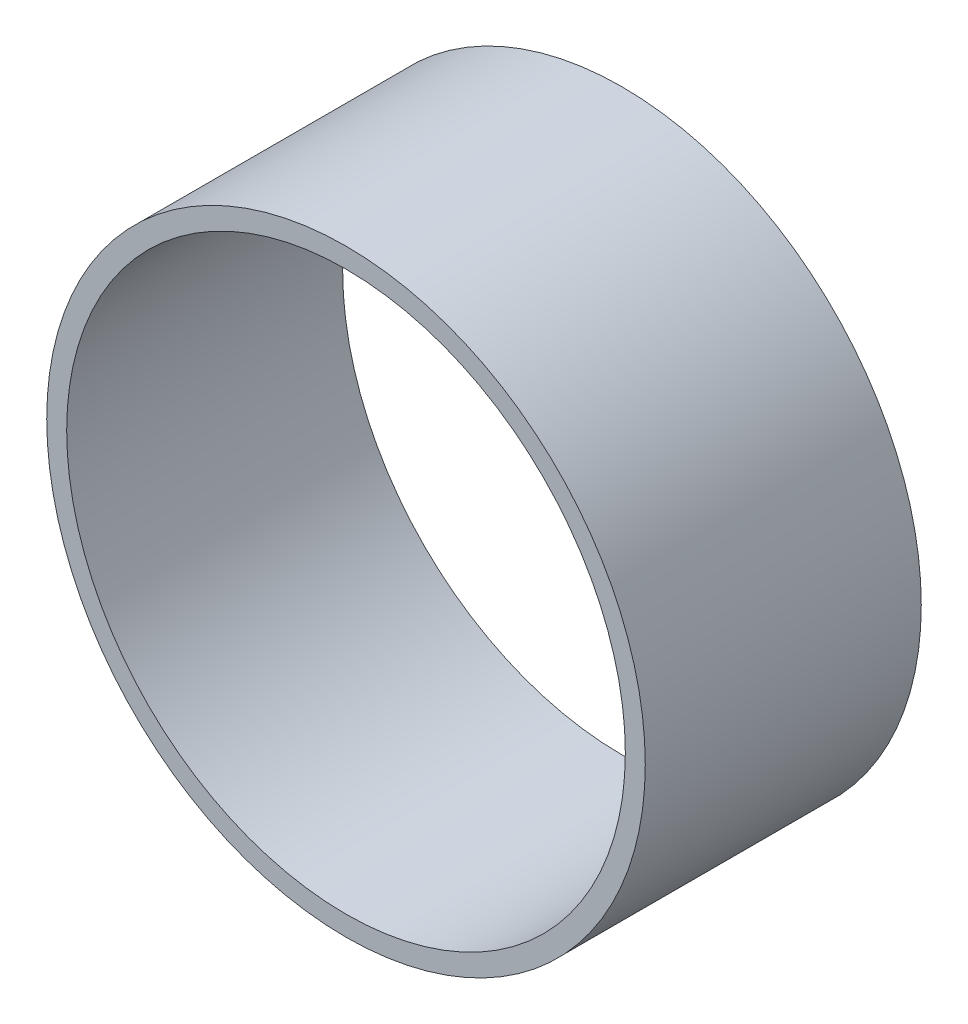
ISO-10303-21;
HEADER;
FILE_DESCRIPTION(('STEP AP214'),'2;1');
FILE_NAME('part.step','',(''),(''),'','','');
FILE_SCHEMA(('AUTOMOTIVE_DESIGN { 1 0 10303 214 1 1 1 1 }'));
ENDSEC;
DATA;
#1=APPLICATION_CONTEXT('core data for automotive mechanical design processes');
#2=APPLICATION_PROTOCOL_DEFINITION('international standard','automotive_design',2000,#1);
#3=PRODUCT_CONTEXT('',#1,'mechanical');
#4=PRODUCT('Part','Part','',(#3));
#5=PRODUCT_RELATED_PRODUCT_CATEGORY('part','',(#4));
#6=PRODUCT_DEFINITION_FORMATION('','',#4);
#7=PRODUCT_DEFINITION_CONTEXT('part definition',#1,'design');
#8=PRODUCT_DEFINITION('design','',#6,#7);
#9=PRODUCT_DEFINITION_SHAPE('','',#8);
#10=(LENGTH_UNIT() NAMED_UNIT(*) SI_UNIT(.MILLI.,.METRE.));
#11=(NAMED_UNIT(*) PLANE_ANGLE_UNIT() SI_UNIT($,.RADIAN.));
#12=(NAMED_UNIT(*) SI_UNIT($,.STERADIAN.) SOLID_ANGLE_UNIT());
#13=UNCERTAINTY_MEASURE_WITH_UNIT(LENGTH_MEASURE(1.E-05),#10,'distance_accuracy_value','');
#14=(GEOMETRIC_REPRESENTATION_CONTEXT(3) GLOBAL_UNCERTAINTY_ASSIGNED_CONTEXT((#13)) GLOBAL_UNIT_ASSIGNED_CONTEXT((#10,
#11,#12)) REPRESENTATION_CONTEXT('',''));
#15=CARTESIAN_POINT('',(0.,0.,0.));
#16=DIRECTION('',(0.,0.,1.));
#17=DIRECTION('',(1.,0.,0.));
#18=AXIS2_PLACEMENT_3D('',#15,#16,#17);
#19=CARTESIAN_POINT('',(300.,300.,113.));
#20=DIRECTION('',(0.,0.,-1.));
#21=DIRECTION('',(-1.,0.,0.));
#22=AXIS2_PLACEMENT_3D('',#19,#20,#21);
#23=CYLINDRICAL_SURFACE('',#22,90.0000000000001);
#24=CARTESIAN_POINT('',(300.,300.,113.));
#25=DIRECTION('',(0.,0.,1.));
#26=DIRECTION('',(1.,0.,0.));
#27=AXIS2_PLACEMENT_3D('',#24,#25,#26);
#28=CIRCLE('',#27,90.0000000000001);
#29=CARTESIAN_POINT('',(390.,300.,113.));
#30=VERTEX_POINT('',#29);
#31=EDGE_CURVE('E10',#30,#30,#28,.T.);
#32=ORIENTED_EDGE('',*,*,#31,.F.);
#33=EDGE_LOOP('',(#32));
#34=FACE_BOUND('',#33,.T.);
#35=CARTESIAN_POINT('',(300.,300.,30.));
#36=DIRECTION('',(0.,0.,1.));
#37=DIRECTION('',(1.,0.,0.));
#38=AXIS2_PLACEMENT_3D('',#35,#36,#37);
#39=CIRCLE('',#38,90.0000000000001);
#40=CARTESIAN_POINT('',(390.,300.,30.));
#41=VERTEX_POINT('',#40);
#42=EDGE_CURVE('E42',#41,#41,#39,.T.);
#43=ORIENTED_EDGE('',*,*,#42,.T.);
#44=EDGE_LOOP('',(#43));
#45=FACE_BOUND('',#44,.T.);
#46=ADVANCED_FACE('F40',(#34,#45),#23,.T.);
#47=CARTESIAN_POINT('',(300.,300.,113.));
#48=DIRECTION('',(0.,0.,1.));
#49=DIRECTION('',(1.,0.,0.));
#50=AXIS2_PLACEMENT_3D('',#47,#48,#49);
#51=PLANE('',#50);
#52=CARTESIAN_POINT('',(300.,300.,113.));
#53=DIRECTION('',(0.,0.,1.));
#54=DIRECTION('',(1.,0.,0.));
#55=AXIS2_PLACEMENT_3D('',#52,#53,#54);
#56=CIRCLE('',#55,84.);
#57=CARTESIAN_POINT('',(384.,300.,113.));
#58=VERTEX_POINT('',#57);
#59=EDGE_CURVE('E49',#58,#58,#56,.T.);
#60=ORIENTED_EDGE('',*,*,#59,.F.);
#61=EDGE_LOOP('',(#60));
#62=FACE_BOUND('',#61,.T.);
#63=ORIENTED_EDGE('',*,*,#31,.T.);
#64=EDGE_LOOP('',(#63));
#65=FACE_BOUND('',#64,.T.);
#66=ADVANCED_FACE('F66',(#62,#65),#51,.T.);
#67=CARTESIAN_POINT('',(300.,300.,30.));
#68=DIRECTION('',(0.,0.,1.));
#69=DIRECTION('',(1.,0.,0.));
#70=AXIS2_PLACEMENT_3D('',#67,#68,#69);
#71=PLANE('',#70);
#72=CARTESIAN_POINT('',(300.,300.,30.));
#73=DIRECTION('',(0.,0.,1.));
#74=DIRECTION('',(1.,0.,0.));
#75=AXIS2_PLACEMENT_3D('',#72,#73,#74);
#76=CIRCLE('',#75,84.);
#77=CARTESIAN_POINT('',(384.,300.,30.));
#78=VERTEX_POINT('',#77);
#79=EDGE_CURVE('E37',#78,#78,#76,.T.);
#80=ORIENTED_EDGE('',*,*,#79,.T.);
#81=EDGE_LOOP('',(#80));
#82=FACE_BOUND('',#81,.T.);
#83=ORIENTED_EDGE('',*,*,#42,.F.);
#84=EDGE_LOOP('',(#83));
#85=FACE_BOUND('',#84,.T.);
#86=ADVANCED_FACE('F60',(#82,#85),#71,.F.);
#87=CARTESIAN_POINT('',(300.,300.,10.));
#88=DIRECTION('',(0.,0.,1.));
#89=DIRECTION('',(1.,0.,0.));
#90=AXIS2_PLACEMENT_3D('',#87,#88,#89);
#91=CYLINDRICAL_SURFACE('',#90,84.);
#92=ORIENTED_EDGE('',*,*,#59,.T.);
#93=EDGE_LOOP('',(#92));
#94=FACE_BOUND('',#93,.T.);
#95=ORIENTED_EDGE('',*,*,#79,.F.);
#96=EDGE_LOOP('',(#95));
#97=FACE_BOUND('',#96,.T.);
#98=ADVANCED_FACE('F58',(#94,#97),#91,.F.);
#99=CLOSED_SHELL('',(#46,#66,#86,#98));
#100=MANIFOLD_SOLID_BREP('B2',#99);
#101=ADVANCED_BREP_SHAPE_REPRESENTATION('',(#18,#100),#14);
#102=SHAPE_DEFINITION_REPRESENTATION(#9,#101);
ENDSEC;
END-ISO-10303-21;
